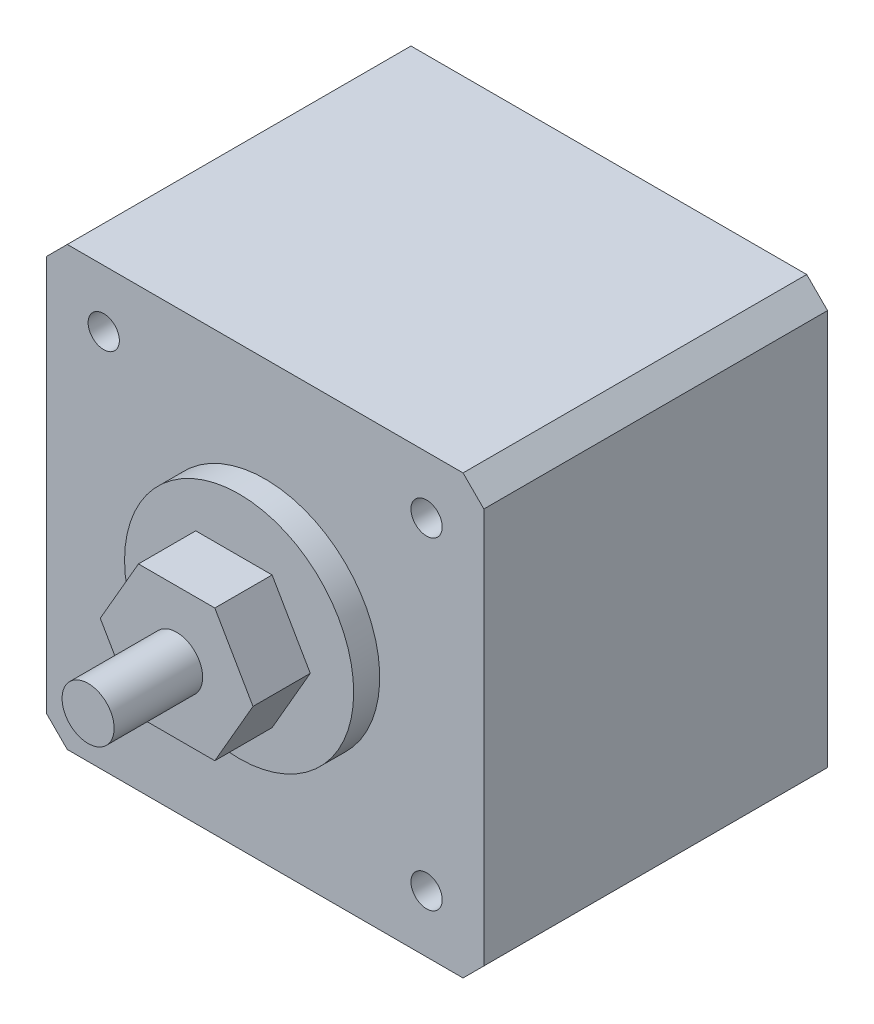
ISO-10303-21;
HEADER;
FILE_DESCRIPTION(('STEP AP214'),'2;1');
FILE_NAME('part.step','',(''),(''),'','','');
FILE_SCHEMA(('AUTOMOTIVE_DESIGN { 1 0 10303 214 1 1 1 1 }'));
ENDSEC;
DATA;
#1=APPLICATION_CONTEXT('core data for automotive mechanical design processes');
#2=APPLICATION_PROTOCOL_DEFINITION('international standard','automotive_design',2000,#1);
#3=PRODUCT_CONTEXT('',#1,'mechanical');
#4=PRODUCT('Part','Part','',(#3));
#5=PRODUCT_RELATED_PRODUCT_CATEGORY('part','',(#4));
#6=PRODUCT_DEFINITION_FORMATION('','',#4);
#7=PRODUCT_DEFINITION_CONTEXT('part definition',#1,'design');
#8=PRODUCT_DEFINITION('design','',#6,#7);
#9=PRODUCT_DEFINITION_SHAPE('','',#8);
#10=(LENGTH_UNIT() NAMED_UNIT(*) SI_UNIT(.MILLI.,.METRE.));
#11=(NAMED_UNIT(*) PLANE_ANGLE_UNIT() SI_UNIT($,.RADIAN.));
#12=(NAMED_UNIT(*) SI_UNIT($,.STERADIAN.) SOLID_ANGLE_UNIT());
#13=UNCERTAINTY_MEASURE_WITH_UNIT(LENGTH_MEASURE(1.E-05),#10,'distance_accuracy_value','');
#14=(GEOMETRIC_REPRESENTATION_CONTEXT(3) GLOBAL_UNCERTAINTY_ASSIGNED_CONTEXT((#13)) GLOBAL_UNIT_ASSIGNED_CONTEXT((#10,
#11,#12)) REPRESENTATION_CONTEXT('',''));
#15=CARTESIAN_POINT('',(0.,0.,0.));
#16=DIRECTION('',(0.,0.,1.));
#17=DIRECTION('',(1.,0.,0.));
#18=AXIS2_PLACEMENT_3D('',#15,#16,#17);
#19=CARTESIAN_POINT('',(0.,0.,-1.49999999999999));
#20=DIRECTION('',(0.,0.,1.));
#21=DIRECTION('',(1.,0.,0.));
#22=AXIS2_PLACEMENT_3D('',#19,#20,#21);
#23=CYLINDRICAL_SURFACE('',#22,2.5);
#24=CARTESIAN_POINT('',(0.,0.,35.5));
#25=DIRECTION('',(0.,0.,1.));
#26=DIRECTION('',(1.,0.,0.));
#27=AXIS2_PLACEMENT_3D('',#24,#25,#26);
#28=CIRCLE('',#27,2.5);
#29=CARTESIAN_POINT('',(2.5,0.,35.5));
#30=VERTEX_POINT('',#29);
#31=EDGE_CURVE('E184',#30,#30,#28,.T.);
#32=ORIENTED_EDGE('',*,*,#31,.T.);
#33=EDGE_LOOP('',(#32));
#34=FACE_BOUND('',#33,.T.);
#35=CARTESIAN_POINT('',(0.,0.,36.));
#36=DIRECTION('',(0.,0.,1.));
#37=DIRECTION('',(1.,0.,0.));
#38=AXIS2_PLACEMENT_3D('',#35,#36,#37);
#39=CIRCLE('',#38,2.5);
#40=CARTESIAN_POINT('',(2.5,0.,36.));
#41=VERTEX_POINT('',#40);
#42=EDGE_CURVE('E186',#41,#41,#39,.F.);
#43=ORIENTED_EDGE('',*,*,#42,.T.);
#44=EDGE_LOOP('',(#43));
#45=FACE_BOUND('',#44,.T.);
#46=ADVANCED_FACE('F33',(#34,#45),#23,.T.);
#47=CARTESIAN_POINT('',(21.,21.,33.));
#48=DIRECTION('',(0.,0.,-1.));
#49=DIRECTION('',(-1.,0.,0.));
#50=AXIS2_PLACEMENT_3D('',#47,#48,#49);
#51=PLANE('',#50);
#52=DIRECTION('',(-1.,0.,0.));
#53=VECTOR('',#52,1.);
#54=CARTESIAN_POINT('',(-19.,21.,33.));
#55=LINE('',#54,#53);
#56=CARTESIAN_POINT('',(19.,21.,33.));
#57=VERTEX_POINT('',#56);
#58=CARTESIAN_POINT('',(-19.,21.,33.));
#59=VERTEX_POINT('',#58);
#60=EDGE_CURVE('E151',#57,#59,#55,.T.);
#61=ORIENTED_EDGE('',*,*,#60,.T.);
#62=DIRECTION('',(-0.707106781186548,-0.707106781186548,0.));
#63=VECTOR('',#62,1.);
#64=CARTESIAN_POINT('',(-21.,19.,33.));
#65=LINE('',#64,#63);
#66=CARTESIAN_POINT('',(-21.,19.,33.));
#67=VERTEX_POINT('',#66);
#68=EDGE_CURVE('E95',#59,#67,#65,.T.);
#69=ORIENTED_EDGE('',*,*,#68,.T.);
#70=DIRECTION('',(0.,-1.,0.));
#71=VECTOR('',#70,1.);
#72=CARTESIAN_POINT('',(-21.,19.,33.));
#73=LINE('',#72,#71);
#74=CARTESIAN_POINT('',(-21.,-19.,33.));
#75=VERTEX_POINT('',#74);
#76=EDGE_CURVE('E226',#67,#75,#73,.T.);
#77=ORIENTED_EDGE('',*,*,#76,.T.);
#78=DIRECTION('',(0.707106781186547,-0.707106781186548,0.));
#79=VECTOR('',#78,1.);
#80=CARTESIAN_POINT('',(-21.,-19.,33.));
#81=LINE('',#80,#79);
#82=CARTESIAN_POINT('',(-19.,-21.,33.));
#83=VERTEX_POINT('',#82);
#84=EDGE_CURVE('E228',#75,#83,#81,.T.);
#85=ORIENTED_EDGE('',*,*,#84,.T.);
#86=DIRECTION('',(1.,0.,0.));
#87=VECTOR('',#86,1.);
#88=CARTESIAN_POINT('',(-19.,-21.,33.));
#89=LINE('',#88,#87);
#90=CARTESIAN_POINT('',(19.,-21.,33.));
#91=VERTEX_POINT('',#90);
#92=EDGE_CURVE('E118',#83,#91,#89,.T.);
#93=ORIENTED_EDGE('',*,*,#92,.T.);
#94=DIRECTION('',(0.707106781186548,0.707106781186548,0.));
#95=VECTOR('',#94,1.);
#96=CARTESIAN_POINT('',(21.,-19.,33.));
#97=LINE('',#96,#95);
#98=CARTESIAN_POINT('',(21.,-19.,33.));
#99=VERTEX_POINT('',#98);
#100=EDGE_CURVE('E111',#91,#99,#97,.T.);
#101=ORIENTED_EDGE('',*,*,#100,.T.);
#102=DIRECTION('',(0.,1.,0.));
#103=VECTOR('',#102,1.);
#104=CARTESIAN_POINT('',(21.,19.,33.));
#105=LINE('',#104,#103);
#106=CARTESIAN_POINT('',(21.,19.,33.));
#107=VERTEX_POINT('',#106);
#108=EDGE_CURVE('E116',#99,#107,#105,.T.);
#109=ORIENTED_EDGE('',*,*,#108,.T.);
#110=DIRECTION('',(-0.707106781186548,0.707106781186548,0.));
#111=VECTOR('',#110,1.);
#112=CARTESIAN_POINT('',(19.,21.,33.));
#113=LINE('',#112,#111);
#114=EDGE_CURVE('E50',#107,#57,#113,.T.);
#115=ORIENTED_EDGE('',*,*,#114,.T.);
#116=EDGE_LOOP('',(#61,#69,#77,#85,#93,#101,#109,#115));
#117=FACE_BOUND('',#116,.T.);
#118=CARTESIAN_POINT('',(-15.5,15.5,33.));
#119=DIRECTION('',(0.,0.,1.));
#120=DIRECTION('',(1.,0.,0.));
#121=AXIS2_PLACEMENT_3D('',#118,#119,#120);
#122=CIRCLE('',#121,1.5);
#123=CARTESIAN_POINT('',(-14.,15.5,33.));
#124=VERTEX_POINT('',#123);
#125=EDGE_CURVE('E169',#124,#124,#122,.T.);
#126=ORIENTED_EDGE('',*,*,#125,.F.);
#127=EDGE_LOOP('',(#126));
#128=FACE_BOUND('',#127,.T.);
#129=CARTESIAN_POINT('',(15.5,15.5,33.));
#130=DIRECTION('',(0.,0.,1.));
#131=DIRECTION('',(1.,0.,0.));
#132=AXIS2_PLACEMENT_3D('',#129,#130,#131);
#133=CIRCLE('',#132,1.5);
#134=CARTESIAN_POINT('',(17.,15.5,33.));
#135=VERTEX_POINT('',#134);
#136=EDGE_CURVE('E173',#135,#135,#133,.T.);
#137=ORIENTED_EDGE('',*,*,#136,.F.);
#138=EDGE_LOOP('',(#137));
#139=FACE_BOUND('',#138,.T.);
#140=CARTESIAN_POINT('',(-15.5,-15.5,33.));
#141=DIRECTION('',(0.,0.,1.));
#142=DIRECTION('',(1.,0.,0.));
#143=AXIS2_PLACEMENT_3D('',#140,#141,#142);
#144=CIRCLE('',#143,1.5);
#145=CARTESIAN_POINT('',(-14.,-15.5,33.));
#146=VERTEX_POINT('',#145);
#147=EDGE_CURVE('E177',#146,#146,#144,.T.);
#148=ORIENTED_EDGE('',*,*,#147,.F.);
#149=EDGE_LOOP('',(#148));
#150=FACE_BOUND('',#149,.T.);
#151=CARTESIAN_POINT('',(15.5,-15.5,33.));
#152=DIRECTION('',(0.,0.,1.));
#153=DIRECTION('',(1.,0.,0.));
#154=AXIS2_PLACEMENT_3D('',#151,#152,#153);
#155=CIRCLE('',#154,1.5);
#156=CARTESIAN_POINT('',(17.,-15.5,33.));
#157=VERTEX_POINT('',#156);
#158=EDGE_CURVE('E181',#157,#157,#155,.T.);
#159=ORIENTED_EDGE('',*,*,#158,.F.);
#160=EDGE_LOOP('',(#159));
#161=FACE_BOUND('',#160,.T.);
#162=CARTESIAN_POINT('',(0.,0.,33.));
#163=DIRECTION('',(0.,0.,-1.));
#164=DIRECTION('',(-1.,0.,0.));
#165=AXIS2_PLACEMENT_3D('',#162,#163,#164);
#166=CIRCLE('',#165,11.);
#167=CARTESIAN_POINT('',(-11.,0.,33.));
#168=VERTEX_POINT('',#167);
#169=EDGE_CURVE('E166',#168,#168,#166,.F.);
#170=ORIENTED_EDGE('',*,*,#169,.F.);
#171=EDGE_LOOP('',(#170));
#172=FACE_BOUND('',#171,.T.);
#173=ADVANCED_FACE('F113',(#117,#128,#139,#150,#161,#172),#51,.F.);
#174=CARTESIAN_POINT('',(-19.,21.,33.));
#175=DIRECTION('',(0.,-1.,0.));
#176=DIRECTION('',(0.,0.,-1.));
#177=AXIS2_PLACEMENT_3D('',#174,#175,#176);
#178=PLANE('',#177);
#179=DIRECTION('',(-1.,0.,0.));
#180=VECTOR('',#179,1.);
#181=CARTESIAN_POINT('',(-19.,21.,0.));
#182=LINE('',#181,#180);
#183=CARTESIAN_POINT('',(19.,21.,0.));
#184=VERTEX_POINT('',#183);
#185=CARTESIAN_POINT('',(-19.,21.,0.));
#186=VERTEX_POINT('',#185);
#187=EDGE_CURVE('E136',#184,#186,#182,.T.);
#188=ORIENTED_EDGE('',*,*,#187,.T.);
#189=DIRECTION('',(0.,0.,-1.));
#190=VECTOR('',#189,1.);
#191=CARTESIAN_POINT('',(-19.,21.,33.));
#192=LINE('',#191,#190);
#193=EDGE_CURVE('E164',#59,#186,#192,.T.);
#194=ORIENTED_EDGE('',*,*,#193,.F.);
#195=ORIENTED_EDGE('',*,*,#60,.F.);
#196=DIRECTION('',(0.,0.,-1.));
#197=VECTOR('',#196,1.);
#198=CARTESIAN_POINT('',(19.,21.,33.));
#199=LINE('',#198,#197);
#200=EDGE_CURVE('E132',#57,#184,#199,.T.);
#201=ORIENTED_EDGE('',*,*,#200,.T.);
#202=EDGE_LOOP('',(#188,#194,#195,#201));
#203=FACE_BOUND('',#202,.T.);
#204=ADVANCED_FACE('F35',(#203),#178,.F.);
#205=CARTESIAN_POINT('',(-21.,19.,33.));
#206=DIRECTION('',(0.707106781186548,-0.707106781186548,0.));
#207=DIRECTION('',(0.707106781186548,0.707106781186548,0.));
#208=AXIS2_PLACEMENT_3D('',#205,#206,#207);
#209=PLANE('',#208);
#210=DIRECTION('',(-0.707106781186548,-0.707106781186548,0.));
#211=VECTOR('',#210,1.);
#212=CARTESIAN_POINT('',(-21.,19.,0.));
#213=LINE('',#212,#211);
#214=CARTESIAN_POINT('',(-21.,19.,0.));
#215=VERTEX_POINT('',#214);
#216=EDGE_CURVE('E139',#186,#215,#213,.T.);
#217=ORIENTED_EDGE('',*,*,#216,.T.);
#218=DIRECTION('',(0.,0.,-1.));
#219=VECTOR('',#218,1.);
#220=CARTESIAN_POINT('',(-21.,19.,33.));
#221=LINE('',#220,#219);
#222=EDGE_CURVE('E161',#67,#215,#221,.T.);
#223=ORIENTED_EDGE('',*,*,#222,.F.);
#224=ORIENTED_EDGE('',*,*,#68,.F.);
#225=ORIENTED_EDGE('',*,*,#193,.T.);
#226=EDGE_LOOP('',(#217,#223,#224,#225));
#227=FACE_BOUND('',#226,.T.);
#228=ADVANCED_FACE('F487',(#227),#209,.F.);
#229=CARTESIAN_POINT('',(-21.,19.,33.));
#230=DIRECTION('',(1.,0.,0.));
#231=DIRECTION('',(0.,1.,0.));
#232=AXIS2_PLACEMENT_3D('',#229,#230,#231);
#233=PLANE('',#232);
#234=DIRECTION('',(0.,-1.,0.));
#235=VECTOR('',#234,1.);
#236=CARTESIAN_POINT('',(-21.,19.,0.));
#237=LINE('',#236,#235);
#238=CARTESIAN_POINT('',(-21.,-19.,0.));
#239=VERTEX_POINT('',#238);
#240=EDGE_CURVE('E142',#215,#239,#237,.T.);
#241=ORIENTED_EDGE('',*,*,#240,.T.);
#242=DIRECTION('',(0.,0.,-1.));
#243=VECTOR('',#242,1.);
#244=CARTESIAN_POINT('',(-21.,-19.,33.));
#245=LINE('',#244,#243);
#246=EDGE_CURVE('E158',#75,#239,#245,.T.);
#247=ORIENTED_EDGE('',*,*,#246,.F.);
#248=ORIENTED_EDGE('',*,*,#76,.F.);
#249=ORIENTED_EDGE('',*,*,#222,.T.);
#250=EDGE_LOOP('',(#241,#247,#248,#249));
#251=FACE_BOUND('',#250,.T.);
#252=ADVANCED_FACE('F525',(#251),#233,.F.);
#253=CARTESIAN_POINT('',(-21.,-19.,33.));
#254=DIRECTION('',(0.707106781186548,0.707106781186547,0.));
#255=DIRECTION('',(-0.707106781186547,0.707106781186548,0.));
#256=AXIS2_PLACEMENT_3D('',#253,#254,#255);
#257=PLANE('',#256);
#258=DIRECTION('',(0.707106781186547,-0.707106781186548,0.));
#259=VECTOR('',#258,1.);
#260=CARTESIAN_POINT('',(-21.,-19.,0.));
#261=LINE('',#260,#259);
#262=CARTESIAN_POINT('',(-19.,-21.,0.));
#263=VERTEX_POINT('',#262);
#264=EDGE_CURVE('E144',#239,#263,#261,.T.);
#265=ORIENTED_EDGE('',*,*,#264,.T.);
#266=DIRECTION('',(0.,0.,-1.));
#267=VECTOR('',#266,1.);
#268=CARTESIAN_POINT('',(-19.,-21.,33.));
#269=LINE('',#268,#267);
#270=EDGE_CURVE('E155',#83,#263,#269,.T.);
#271=ORIENTED_EDGE('',*,*,#270,.F.);
#272=ORIENTED_EDGE('',*,*,#84,.F.);
#273=ORIENTED_EDGE('',*,*,#246,.T.);
#274=EDGE_LOOP('',(#265,#271,#272,#273));
#275=FACE_BOUND('',#274,.T.);
#276=ADVANCED_FACE('F234',(#275),#257,.F.);
#277=CARTESIAN_POINT('',(-19.,-21.,33.));
#278=DIRECTION('',(0.,1.,0.));
#279=DIRECTION('',(-1.,0.,0.));
#280=AXIS2_PLACEMENT_3D('',#277,#278,#279);
#281=PLANE('',#280);
#282=DIRECTION('',(1.,0.,0.));
#283=VECTOR('',#282,1.);
#284=CARTESIAN_POINT('',(-19.,-21.,0.));
#285=LINE('',#284,#283);
#286=CARTESIAN_POINT('',(19.,-21.,0.));
#287=VERTEX_POINT('',#286);
#288=EDGE_CURVE('E146',#263,#287,#285,.T.);
#289=ORIENTED_EDGE('',*,*,#288,.T.);
#290=DIRECTION('',(0.,0.,-1.));
#291=VECTOR('',#290,1.);
#292=CARTESIAN_POINT('',(19.,-21.,33.));
#293=LINE('',#292,#291);
#294=EDGE_CURVE('E127',#91,#287,#293,.T.);
#295=ORIENTED_EDGE('',*,*,#294,.F.);
#296=ORIENTED_EDGE('',*,*,#92,.F.);
#297=ORIENTED_EDGE('',*,*,#270,.T.);
#298=EDGE_LOOP('',(#289,#295,#296,#297));
#299=FACE_BOUND('',#298,.T.);
#300=ADVANCED_FACE('F238',(#299),#281,.F.);
#301=CARTESIAN_POINT('',(21.,-19.,33.));
#302=DIRECTION('',(-0.707106781186548,0.707106781186548,0.));
#303=DIRECTION('',(-0.707106781186548,-0.707106781186548,0.));
#304=AXIS2_PLACEMENT_3D('',#301,#302,#303);
#305=PLANE('',#304);
#306=DIRECTION('',(0.707106781186548,0.707106781186548,0.));
#307=VECTOR('',#306,1.);
#308=CARTESIAN_POINT('',(21.,-19.,0.));
#309=LINE('',#308,#307);
#310=CARTESIAN_POINT('',(21.,-19.,0.));
#311=VERTEX_POINT('',#310);
#312=EDGE_CURVE('E126',#287,#311,#309,.T.);
#313=ORIENTED_EDGE('',*,*,#312,.T.);
#314=DIRECTION('',(0.,0.,-1.));
#315=VECTOR('',#314,1.);
#316=CARTESIAN_POINT('',(21.,-19.,33.));
#317=LINE('',#316,#315);
#318=EDGE_CURVE('E123',#99,#311,#317,.T.);
#319=ORIENTED_EDGE('',*,*,#318,.F.);
#320=ORIENTED_EDGE('',*,*,#100,.F.);
#321=ORIENTED_EDGE('',*,*,#294,.T.);
#322=EDGE_LOOP('',(#313,#319,#320,#321));
#323=FACE_BOUND('',#322,.T.);
#324=ADVANCED_FACE('F124',(#323),#305,.F.);
#325=CARTESIAN_POINT('',(21.,19.,33.));
#326=DIRECTION('',(-1.,0.,0.));
#327=DIRECTION('',(0.,0.,1.));
#328=AXIS2_PLACEMENT_3D('',#325,#326,#327);
#329=PLANE('',#328);
#330=DIRECTION('',(0.,1.,0.));
#331=VECTOR('',#330,1.);
#332=CARTESIAN_POINT('',(21.,19.,0.));
#333=LINE('',#332,#331);
#334=CARTESIAN_POINT('',(21.,19.,0.));
#335=VERTEX_POINT('',#334);
#336=EDGE_CURVE('E80',#311,#335,#333,.T.);
#337=ORIENTED_EDGE('',*,*,#336,.T.);
#338=DIRECTION('',(0.,0.,-1.));
#339=VECTOR('',#338,1.);
#340=CARTESIAN_POINT('',(21.,19.,33.));
#341=LINE('',#340,#339);
#342=EDGE_CURVE('E128',#107,#335,#341,.T.);
#343=ORIENTED_EDGE('',*,*,#342,.F.);
#344=ORIENTED_EDGE('',*,*,#108,.F.);
#345=ORIENTED_EDGE('',*,*,#318,.T.);
#346=EDGE_LOOP('',(#337,#343,#344,#345));
#347=FACE_BOUND('',#346,.T.);
#348=ADVANCED_FACE('F130',(#347),#329,.F.);
#349=CARTESIAN_POINT('',(19.,21.,33.));
#350=DIRECTION('',(-0.707106781186548,-0.707106781186548,0.));
#351=DIRECTION('',(0.707106781186548,-0.707106781186548,0.));
#352=AXIS2_PLACEMENT_3D('',#349,#350,#351);
#353=PLANE('',#352);
#354=DIRECTION('',(-0.707106781186548,0.707106781186548,0.));
#355=VECTOR('',#354,1.);
#356=CARTESIAN_POINT('',(19.,21.,0.));
#357=LINE('',#356,#355);
#358=EDGE_CURVE('E86',#335,#184,#357,.T.);
#359=ORIENTED_EDGE('',*,*,#358,.T.);
#360=ORIENTED_EDGE('',*,*,#200,.F.);
#361=ORIENTED_EDGE('',*,*,#114,.F.);
#362=ORIENTED_EDGE('',*,*,#342,.T.);
#363=EDGE_LOOP('',(#359,#360,#361,#362));
#364=FACE_BOUND('',#363,.T.);
#365=ADVANCED_FACE('F246',(#364),#353,.F.);
#366=CARTESIAN_POINT('',(21.,21.,0.));
#367=DIRECTION('',(0.,0.,-1.));
#368=DIRECTION('',(-1.,0.,0.));
#369=AXIS2_PLACEMENT_3D('',#366,#367,#368);
#370=PLANE('',#369);
#371=CARTESIAN_POINT('',(0.,0.,0.));
#372=DIRECTION('',(0.,0.,-1.));
#373=DIRECTION('',(-1.,0.,0.));
#374=AXIS2_PLACEMENT_3D('',#371,#372,#373);
#375=CIRCLE('',#374,2.5);
#376=CARTESIAN_POINT('',(-2.5,0.,0.));
#377=VERTEX_POINT('',#376);
#378=EDGE_CURVE('E42',#377,#377,#375,.T.);
#379=ORIENTED_EDGE('',*,*,#378,.F.);
#380=EDGE_LOOP('',(#379));
#381=FACE_BOUND('',#380,.T.);
#382=CARTESIAN_POINT('',(15.5,-15.5,0.));
#383=DIRECTION('',(0.,0.,-1.));
#384=DIRECTION('',(-1.,0.,0.));
#385=AXIS2_PLACEMENT_3D('',#382,#383,#384);
#386=CIRCLE('',#385,1.5);
#387=CARTESIAN_POINT('',(14.,-15.5,0.));
#388=VERTEX_POINT('',#387);
#389=EDGE_CURVE('E178',#388,#388,#386,.T.);
#390=ORIENTED_EDGE('',*,*,#389,.F.);
#391=EDGE_LOOP('',(#390));
#392=FACE_BOUND('',#391,.T.);
#393=CARTESIAN_POINT('',(-15.5,-15.5,0.));
#394=DIRECTION('',(0.,0.,-1.));
#395=DIRECTION('',(-1.,0.,0.));
#396=AXIS2_PLACEMENT_3D('',#393,#394,#395);
#397=CIRCLE('',#396,1.5);
#398=CARTESIAN_POINT('',(-17.,-15.5,0.));
#399=VERTEX_POINT('',#398);
#400=EDGE_CURVE('E174',#399,#399,#397,.T.);
#401=ORIENTED_EDGE('',*,*,#400,.F.);
#402=EDGE_LOOP('',(#401));
#403=FACE_BOUND('',#402,.T.);
#404=CARTESIAN_POINT('',(15.5,15.5,0.));
#405=DIRECTION('',(0.,0.,-1.));
#406=DIRECTION('',(-1.,0.,0.));
#407=AXIS2_PLACEMENT_3D('',#404,#405,#406);
#408=CIRCLE('',#407,1.5);
#409=CARTESIAN_POINT('',(14.,15.5,0.));
#410=VERTEX_POINT('',#409);
#411=EDGE_CURVE('E170',#410,#410,#408,.T.);
#412=ORIENTED_EDGE('',*,*,#411,.F.);
#413=EDGE_LOOP('',(#412));
#414=FACE_BOUND('',#413,.T.);
#415=CARTESIAN_POINT('',(-15.5,15.5,0.));
#416=DIRECTION('',(0.,0.,-1.));
#417=DIRECTION('',(-1.,0.,0.));
#418=AXIS2_PLACEMENT_3D('',#415,#416,#417);
#419=CIRCLE('',#418,1.5);
#420=CARTESIAN_POINT('',(-17.,15.5,0.));
#421=VERTEX_POINT('',#420);
#422=EDGE_CURVE('E140',#421,#421,#419,.T.);
#423=ORIENTED_EDGE('',*,*,#422,.F.);
#424=EDGE_LOOP('',(#423));
#425=FACE_BOUND('',#424,.T.);
#426=ORIENTED_EDGE('',*,*,#187,.F.);
#427=ORIENTED_EDGE('',*,*,#358,.F.);
#428=ORIENTED_EDGE('',*,*,#336,.F.);
#429=ORIENTED_EDGE('',*,*,#312,.F.);
#430=ORIENTED_EDGE('',*,*,#288,.F.);
#431=ORIENTED_EDGE('',*,*,#264,.F.);
#432=ORIENTED_EDGE('',*,*,#240,.F.);
#433=ORIENTED_EDGE('',*,*,#216,.F.);
#434=EDGE_LOOP('',(#426,#427,#428,#429,#430,#431,#432,#433));
#435=FACE_BOUND('',#434,.T.);
#436=ADVANCED_FACE('F241',(#381,#392,#403,#414,#425,#435),#370,.T.);
#437=CARTESIAN_POINT('',(-15.5,15.5,-10.));
#438=DIRECTION('',(0.,0.,1.));
#439=DIRECTION('',(1.,0.,0.));
#440=AXIS2_PLACEMENT_3D('',#437,#438,#439);
#441=CYLINDRICAL_SURFACE('',#440,1.5);
#442=ORIENTED_EDGE('',*,*,#422,.T.);
#443=EDGE_LOOP('',(#442));
#444=FACE_BOUND('',#443,.T.);
#445=ORIENTED_EDGE('',*,*,#125,.T.);
#446=EDGE_LOOP('',(#445));
#447=FACE_BOUND('',#446,.T.);
#448=ADVANCED_FACE('F253',(#444,#447),#441,.F.);
#449=CARTESIAN_POINT('',(15.5,15.5,-10.));
#450=DIRECTION('',(0.,0.,1.));
#451=DIRECTION('',(1.,0.,0.));
#452=AXIS2_PLACEMENT_3D('',#449,#450,#451);
#453=CYLINDRICAL_SURFACE('',#452,1.5);
#454=ORIENTED_EDGE('',*,*,#411,.T.);
#455=EDGE_LOOP('',(#454));
#456=FACE_BOUND('',#455,.T.);
#457=ORIENTED_EDGE('',*,*,#136,.T.);
#458=EDGE_LOOP('',(#457));
#459=FACE_BOUND('',#458,.T.);
#460=ADVANCED_FACE('F563',(#456,#459),#453,.F.);
#461=CARTESIAN_POINT('',(-15.5,-15.5,-10.));
#462=DIRECTION('',(0.,0.,1.));
#463=DIRECTION('',(1.,0.,0.));
#464=AXIS2_PLACEMENT_3D('',#461,#462,#463);
#465=CYLINDRICAL_SURFACE('',#464,1.5);
#466=ORIENTED_EDGE('',*,*,#400,.T.);
#467=EDGE_LOOP('',(#466));
#468=FACE_BOUND('',#467,.T.);
#469=ORIENTED_EDGE('',*,*,#147,.T.);
#470=EDGE_LOOP('',(#469));
#471=FACE_BOUND('',#470,.T.);
#472=ADVANCED_FACE('F572',(#468,#471),#465,.F.);
#473=CARTESIAN_POINT('',(15.5,-15.5,-10.));
#474=DIRECTION('',(0.,0.,1.));
#475=DIRECTION('',(1.,0.,0.));
#476=AXIS2_PLACEMENT_3D('',#473,#474,#475);
#477=CYLINDRICAL_SURFACE('',#476,1.5);
#478=ORIENTED_EDGE('',*,*,#389,.T.);
#479=EDGE_LOOP('',(#478));
#480=FACE_BOUND('',#479,.T.);
#481=ORIENTED_EDGE('',*,*,#158,.T.);
#482=EDGE_LOOP('',(#481));
#483=FACE_BOUND('',#482,.T.);
#484=ADVANCED_FACE('F581',(#480,#483),#477,.F.);
#485=CARTESIAN_POINT('',(0.,0.,35.5));
#486=DIRECTION('',(0.,0.,-1.));
#487=DIRECTION('',(-1.,0.,0.));
#488=AXIS2_PLACEMENT_3D('',#485,#486,#487);
#489=CYLINDRICAL_SURFACE('',#488,11.);
#490=CARTESIAN_POINT('',(0.,0.,35.5));
#491=DIRECTION('',(0.,0.,1.));
#492=DIRECTION('',(1.,0.,0.));
#493=AXIS2_PLACEMENT_3D('',#490,#491,#492);
#494=CIRCLE('',#493,11.);
#495=CARTESIAN_POINT('',(11.,0.,35.5));
#496=VERTEX_POINT('',#495);
#497=EDGE_CURVE('E211',#496,#496,#494,.T.);
#498=ORIENTED_EDGE('',*,*,#497,.F.);
#499=EDGE_LOOP('',(#498));
#500=FACE_BOUND('',#499,.T.);
#501=ORIENTED_EDGE('',*,*,#169,.T.);
#502=EDGE_LOOP('',(#501));
#503=FACE_BOUND('',#502,.T.);
#504=ADVANCED_FACE('F588',(#500,#503),#489,.T.);
#505=CARTESIAN_POINT('',(0.,0.,35.5));
#506=DIRECTION('',(0.,0.,1.));
#507=DIRECTION('',(1.,0.,0.));
#508=AXIS2_PLACEMENT_3D('',#505,#506,#507);
#509=PLANE('',#508);
#510=ORIENTED_EDGE('',*,*,#31,.F.);
#511=EDGE_LOOP('',(#510));
#512=FACE_BOUND('',#511,.T.);
#513=ORIENTED_EDGE('',*,*,#497,.T.);
#514=EDGE_LOOP('',(#513));
#515=FACE_BOUND('',#514,.T.);
#516=ADVANCED_FACE('F270',(#512,#515),#509,.T.);
#517=ORIENTED_EDGE('',*,*,#378,.T.);
#518=EDGE_LOOP('',(#517));
#519=FACE_BOUND('',#518,.T.);
#520=CARTESIAN_POINT('',(0.,0.,-1.49999999999999));
#521=DIRECTION('',(0.,0.,1.));
#522=DIRECTION('',(1.,0.,0.));
#523=AXIS2_PLACEMENT_3D('',#520,#521,#522);
#524=CIRCLE('',#523,2.5);
#525=CARTESIAN_POINT('',(2.5,0.,-1.49999999999999));
#526=VERTEX_POINT('',#525);
#527=EDGE_CURVE('E193',#526,#526,#524,.T.);
#528=ORIENTED_EDGE('',*,*,#527,.T.);
#529=EDGE_LOOP('',(#528));
#530=FACE_BOUND('',#529,.T.);
#531=ADVANCED_FACE('F260',(#519,#530),#23,.T.);
#532=CARTESIAN_POINT('',(0.,0.,-1.49999999999999));
#533=DIRECTION('',(0.,0.,1.));
#534=DIRECTION('',(1.,0.,0.));
#535=AXIS2_PLACEMENT_3D('',#532,#533,#534);
#536=PLANE('',#535);
#537=ORIENTED_EDGE('',*,*,#527,.F.);
#538=EDGE_LOOP('',(#537));
#539=FACE_BOUND('',#538,.T.);
#540=ADVANCED_FACE('F269',(#539),#536,.F.);
#541=CARTESIAN_POINT('',(3.66617420935412,-6.35,41.5));
#542=DIRECTION('',(-0.866025403784439,0.5,0.));
#543=DIRECTION('',(-0.5,-0.866025403784439,0.));
#544=AXIS2_PLACEMENT_3D('',#541,#542,#543);
#545=PLANE('',#544);
#546=DIRECTION('',(0.5,0.866025403784439,0.));
#547=VECTOR('',#546,1.);
#548=CARTESIAN_POINT('',(3.66617420935412,-6.35,36.));
#549=LINE('',#548,#547);
#550=CARTESIAN_POINT('',(3.66617420935412,-6.35,36.));
#551=VERTEX_POINT('',#550);
#552=CARTESIAN_POINT('',(7.33234841870824,0.,36.));
#553=VERTEX_POINT('',#552);
#554=EDGE_CURVE('E311',#551,#553,#549,.T.);
#555=ORIENTED_EDGE('',*,*,#554,.T.);
#556=DIRECTION('',(0.,0.,-1.));
#557=VECTOR('',#556,1.);
#558=CARTESIAN_POINT('',(7.33234841870824,0.,41.5));
#559=LINE('',#558,#557);
#560=CARTESIAN_POINT('',(7.33234841870824,0.,41.5));
#561=VERTEX_POINT('',#560);
#562=EDGE_CURVE('E189',#561,#553,#559,.T.);
#563=ORIENTED_EDGE('',*,*,#562,.F.);
#564=DIRECTION('',(0.5,0.866025403784439,0.));
#565=VECTOR('',#564,1.);
#566=CARTESIAN_POINT('',(3.66617420935412,-6.35,41.5));
#567=LINE('',#566,#565);
#568=CARTESIAN_POINT('',(3.66617420935412,-6.35,41.5));
#569=VERTEX_POINT('',#568);
#570=EDGE_CURVE('E295',#569,#561,#567,.T.);
#571=ORIENTED_EDGE('',*,*,#570,.F.);
#572=DIRECTION('',(0.,0.,-1.));
#573=VECTOR('',#572,1.);
#574=CARTESIAN_POINT('',(3.66617420935412,-6.35,41.5));
#575=LINE('',#574,#573);
#576=EDGE_CURVE('E312',#569,#551,#575,.T.);
#577=ORIENTED_EDGE('',*,*,#576,.T.);
#578=EDGE_LOOP('',(#555,#563,#571,#577));
#579=FACE_BOUND('',#578,.T.);
#580=ADVANCED_FACE('F309',(#579),#545,.F.);
#581=CARTESIAN_POINT('',(7.33234841870824,0.,41.5));
#582=DIRECTION('',(-0.866025403784439,-0.5,0.));
#583=DIRECTION('',(0.5,-0.866025403784439,0.));
#584=AXIS2_PLACEMENT_3D('',#581,#582,#583);
#585=PLANE('',#584);
#586=DIRECTION('',(-0.5,0.866025403784439,0.));
#587=VECTOR('',#586,1.);
#588=CARTESIAN_POINT('',(7.33234841870824,0.,36.));
#589=LINE('',#588,#587);
#590=CARTESIAN_POINT('',(3.66617420935412,6.35,36.));
#591=VERTEX_POINT('',#590);
#592=EDGE_CURVE('E318',#553,#591,#589,.T.);
#593=ORIENTED_EDGE('',*,*,#592,.T.);
#594=DIRECTION('',(0.,0.,-1.));
#595=VECTOR('',#594,1.);
#596=CARTESIAN_POINT('',(3.66617420935412,6.35,41.5));
#597=LINE('',#596,#595);
#598=CARTESIAN_POINT('',(3.66617420935412,6.35,41.5));
#599=VERTEX_POINT('',#598);
#600=EDGE_CURVE('E196',#599,#591,#597,.T.);
#601=ORIENTED_EDGE('',*,*,#600,.F.);
#602=DIRECTION('',(-0.5,0.866025403784439,0.));
#603=VECTOR('',#602,1.);
#604=CARTESIAN_POINT('',(7.33234841870824,0.,41.5));
#605=LINE('',#604,#603);
#606=EDGE_CURVE('E298',#561,#599,#605,.T.);
#607=ORIENTED_EDGE('',*,*,#606,.F.);
#608=ORIENTED_EDGE('',*,*,#562,.T.);
#609=EDGE_LOOP('',(#593,#601,#607,#608));
#610=FACE_BOUND('',#609,.T.);
#611=ADVANCED_FACE('F379',(#610),#585,.F.);
#612=CARTESIAN_POINT('',(3.66617420935412,6.35,41.5));
#613=DIRECTION('',(0.,-1.,0.));
#614=DIRECTION('',(0.,0.,-1.));
#615=AXIS2_PLACEMENT_3D('',#612,#613,#614);
#616=PLANE('',#615);
#617=DIRECTION('',(-1.,0.,0.));
#618=VECTOR('',#617,1.);
#619=CARTESIAN_POINT('',(3.66617420935412,6.35,36.));
#620=LINE('',#619,#618);
#621=CARTESIAN_POINT('',(-3.66617420935412,6.35,36.));
#622=VERTEX_POINT('',#621);
#623=EDGE_CURVE('E320',#591,#622,#620,.T.);
#624=ORIENTED_EDGE('',*,*,#623,.T.);
#625=DIRECTION('',(0.,0.,-1.));
#626=VECTOR('',#625,1.);
#627=CARTESIAN_POINT('',(-3.66617420935412,6.35,41.5));
#628=LINE('',#627,#626);
#629=CARTESIAN_POINT('',(-3.66617420935412,6.35,41.5));
#630=VERTEX_POINT('',#629);
#631=EDGE_CURVE('E205',#630,#622,#628,.T.);
#632=ORIENTED_EDGE('',*,*,#631,.F.);
#633=DIRECTION('',(-1.,0.,0.));
#634=VECTOR('',#633,1.);
#635=CARTESIAN_POINT('',(3.66617420935412,6.35,41.5));
#636=LINE('',#635,#634);
#637=EDGE_CURVE('E369',#599,#630,#636,.T.);
#638=ORIENTED_EDGE('',*,*,#637,.F.);
#639=ORIENTED_EDGE('',*,*,#600,.T.);
#640=EDGE_LOOP('',(#624,#632,#638,#639));
#641=FACE_BOUND('',#640,.T.);
#642=ADVANCED_FACE('F374',(#641),#616,.F.);
#643=CARTESIAN_POINT('',(-3.66617420935412,6.35,41.5));
#644=DIRECTION('',(0.866025403784439,-0.5,0.));
#645=DIRECTION('',(0.5,0.866025403784439,0.));
#646=AXIS2_PLACEMENT_3D('',#643,#644,#645);
#647=PLANE('',#646);
#648=DIRECTION('',(-0.5,-0.866025403784439,0.));
#649=VECTOR('',#648,1.);
#650=CARTESIAN_POINT('',(-3.66617420935412,6.35,36.));
#651=LINE('',#650,#649);
#652=CARTESIAN_POINT('',(-7.33234841870825,0.,36.));
#653=VERTEX_POINT('',#652);
#654=EDGE_CURVE('E327',#622,#653,#651,.T.);
#655=ORIENTED_EDGE('',*,*,#654,.T.);
#656=DIRECTION('',(0.,0.,-1.));
#657=VECTOR('',#656,1.);
#658=CARTESIAN_POINT('',(-7.33234841870825,0.,41.5));
#659=LINE('',#658,#657);
#660=CARTESIAN_POINT('',(-7.33234841870825,0.,41.5));
#661=VERTEX_POINT('',#660);
#662=EDGE_CURVE('E339',#661,#653,#659,.T.);
#663=ORIENTED_EDGE('',*,*,#662,.F.);
#664=DIRECTION('',(-0.5,-0.866025403784439,0.));
#665=VECTOR('',#664,1.);
#666=CARTESIAN_POINT('',(-3.66617420935412,6.35,41.5));
#667=LINE('',#666,#665);
#668=EDGE_CURVE('E352',#630,#661,#667,.T.);
#669=ORIENTED_EDGE('',*,*,#668,.F.);
#670=ORIENTED_EDGE('',*,*,#631,.T.);
#671=EDGE_LOOP('',(#655,#663,#669,#670));
#672=FACE_BOUND('',#671,.T.);
#673=ADVANCED_FACE('F347',(#672),#647,.F.);
#674=CARTESIAN_POINT('',(-7.33234841870825,0.,41.5));
#675=DIRECTION('',(0.866025403784439,0.5,0.));
#676=DIRECTION('',(-0.5,0.866025403784439,0.));
#677=AXIS2_PLACEMENT_3D('',#674,#675,#676);
#678=PLANE('',#677);
#679=DIRECTION('',(0.5,-0.866025403784439,0.));
#680=VECTOR('',#679,1.);
#681=CARTESIAN_POINT('',(-7.33234841870825,0.,36.));
#682=LINE('',#681,#680);
#683=CARTESIAN_POINT('',(-3.66617420935412,-6.35,36.));
#684=VERTEX_POINT('',#683);
#685=EDGE_CURVE('E330',#653,#684,#682,.T.);
#686=ORIENTED_EDGE('',*,*,#685,.T.);
#687=DIRECTION('',(0.,0.,-1.));
#688=VECTOR('',#687,1.);
#689=CARTESIAN_POINT('',(-3.66617420935412,-6.35,41.5));
#690=LINE('',#689,#688);
#691=CARTESIAN_POINT('',(-3.66617420935412,-6.35,41.5));
#692=VERTEX_POINT('',#691);
#693=EDGE_CURVE('E336',#692,#684,#690,.T.);
#694=ORIENTED_EDGE('',*,*,#693,.F.);
#695=DIRECTION('',(0.5,-0.866025403784439,0.));
#696=VECTOR('',#695,1.);
#697=CARTESIAN_POINT('',(-7.33234841870825,0.,41.5));
#698=LINE('',#697,#696);
#699=EDGE_CURVE('E368',#661,#692,#698,.T.);
#700=ORIENTED_EDGE('',*,*,#699,.F.);
#701=ORIENTED_EDGE('',*,*,#662,.T.);
#702=EDGE_LOOP('',(#686,#694,#700,#701));
#703=FACE_BOUND('',#702,.T.);
#704=ADVANCED_FACE('F362',(#703),#678,.F.);
#705=CARTESIAN_POINT('',(-3.66617420935412,-6.35,41.5));
#706=DIRECTION('',(0.,1.,0.));
#707=DIRECTION('',(-1.,0.,0.));
#708=AXIS2_PLACEMENT_3D('',#705,#706,#707);
#709=PLANE('',#708);
#710=DIRECTION('',(1.,0.,0.));
#711=VECTOR('',#710,1.);
#712=CARTESIAN_POINT('',(-3.66617420935412,-6.35,36.));
#713=LINE('',#712,#711);
#714=EDGE_CURVE('E307',#684,#551,#713,.T.);
#715=ORIENTED_EDGE('',*,*,#714,.T.);
#716=ORIENTED_EDGE('',*,*,#576,.F.);
#717=DIRECTION('',(1.,0.,0.));
#718=VECTOR('',#717,1.);
#719=CARTESIAN_POINT('',(-3.66617420935412,-6.35,41.5));
#720=LINE('',#719,#718);
#721=EDGE_CURVE('E302',#692,#569,#720,.T.);
#722=ORIENTED_EDGE('',*,*,#721,.F.);
#723=ORIENTED_EDGE('',*,*,#693,.T.);
#724=EDGE_LOOP('',(#715,#716,#722,#723));
#725=FACE_BOUND('',#724,.T.);
#726=ADVANCED_FACE('F288',(#725),#709,.F.);
#727=CARTESIAN_POINT('',(7.33234841870825,0.,41.5));
#728=DIRECTION('',(0.,0.,1.));
#729=DIRECTION('',(1.,0.,0.));
#730=AXIS2_PLACEMENT_3D('',#727,#728,#729);
#731=PLANE('',#730);
#732=CARTESIAN_POINT('',(0.,0.,41.5));
#733=DIRECTION('',(0.,0.,1.));
#734=DIRECTION('',(1.,0.,0.));
#735=AXIS2_PLACEMENT_3D('',#732,#733,#734);
#736=CIRCLE('',#735,2.5);
#737=CARTESIAN_POINT('',(2.5,0.,41.5));
#738=VERTEX_POINT('',#737);
#739=EDGE_CURVE('E11',#738,#738,#736,.F.);
#740=ORIENTED_EDGE('',*,*,#739,.T.);
#741=EDGE_LOOP('',(#740));
#742=FACE_BOUND('',#741,.T.);
#743=ORIENTED_EDGE('',*,*,#570,.T.);
#744=ORIENTED_EDGE('',*,*,#606,.T.);
#745=ORIENTED_EDGE('',*,*,#637,.T.);
#746=ORIENTED_EDGE('',*,*,#668,.T.);
#747=ORIENTED_EDGE('',*,*,#699,.T.);
#748=ORIENTED_EDGE('',*,*,#721,.T.);
#749=EDGE_LOOP('',(#743,#744,#745,#746,#747,#748));
#750=FACE_BOUND('',#749,.T.);
#751=ADVANCED_FACE('F285',(#742,#750),#731,.T.);
#752=CARTESIAN_POINT('',(7.33234841870825,0.,36.));
#753=DIRECTION('',(0.,0.,1.));
#754=DIRECTION('',(1.,0.,0.));
#755=AXIS2_PLACEMENT_3D('',#752,#753,#754);
#756=PLANE('',#755);
#757=ORIENTED_EDGE('',*,*,#42,.F.);
#758=EDGE_LOOP('',(#757));
#759=FACE_BOUND('',#758,.T.);
#760=ORIENTED_EDGE('',*,*,#554,.F.);
#761=ORIENTED_EDGE('',*,*,#714,.F.);
#762=ORIENTED_EDGE('',*,*,#685,.F.);
#763=ORIENTED_EDGE('',*,*,#654,.F.);
#764=ORIENTED_EDGE('',*,*,#623,.F.);
#765=ORIENTED_EDGE('',*,*,#592,.F.);
#766=EDGE_LOOP('',(#760,#761,#762,#763,#764,#765));
#767=FACE_BOUND('',#766,.T.);
#768=ADVANCED_FACE('F278',(#759,#767),#756,.F.);
#769=CARTESIAN_POINT('',(0.,0.,50.));
#770=DIRECTION('',(0.,0.,1.));
#771=DIRECTION('',(1.,0.,0.));
#772=AXIS2_PLACEMENT_3D('',#769,#770,#771);
#773=PLANE('',#772);
#774=CARTESIAN_POINT('',(0.,0.,50.));
#775=DIRECTION('',(0.,0.,1.));
#776=DIRECTION('',(1.,0.,0.));
#777=AXIS2_PLACEMENT_3D('',#774,#775,#776);
#778=CIRCLE('',#777,2.5);
#779=CARTESIAN_POINT('',(2.5,0.,50.));
#780=VERTEX_POINT('',#779);
#781=EDGE_CURVE('E188',#780,#780,#778,.T.);
#782=ORIENTED_EDGE('',*,*,#781,.T.);
#783=EDGE_LOOP('',(#782));
#784=FACE_BOUND('',#783,.T.);
#785=ADVANCED_FACE('F273',(#784),#773,.T.);
#786=ORIENTED_EDGE('',*,*,#739,.F.);
#787=EDGE_LOOP('',(#786));
#788=FACE_BOUND('',#787,.T.);
#789=ORIENTED_EDGE('',*,*,#781,.F.);
#790=EDGE_LOOP('',(#789));
#791=FACE_BOUND('',#790,.T.);
#792=ADVANCED_FACE('F261',(#788,#791),#23,.T.);
#793=CLOSED_SHELL('',(#46,#173,#204,#228,#252,#276,#300,#324,#348,#365,#436,#448,#460,#472,#484,
#504,#516,#531,#540,#580,#611,#642,#673,#704,#726,#751,#768,#785,#792));
#794=MANIFOLD_SOLID_BREP('B2',#793);
#795=ADVANCED_BREP_SHAPE_REPRESENTATION('',(#18,#794),#14);
#796=SHAPE_DEFINITION_REPRESENTATION(#9,#795);
ENDSEC;
END-ISO-10303-21;
